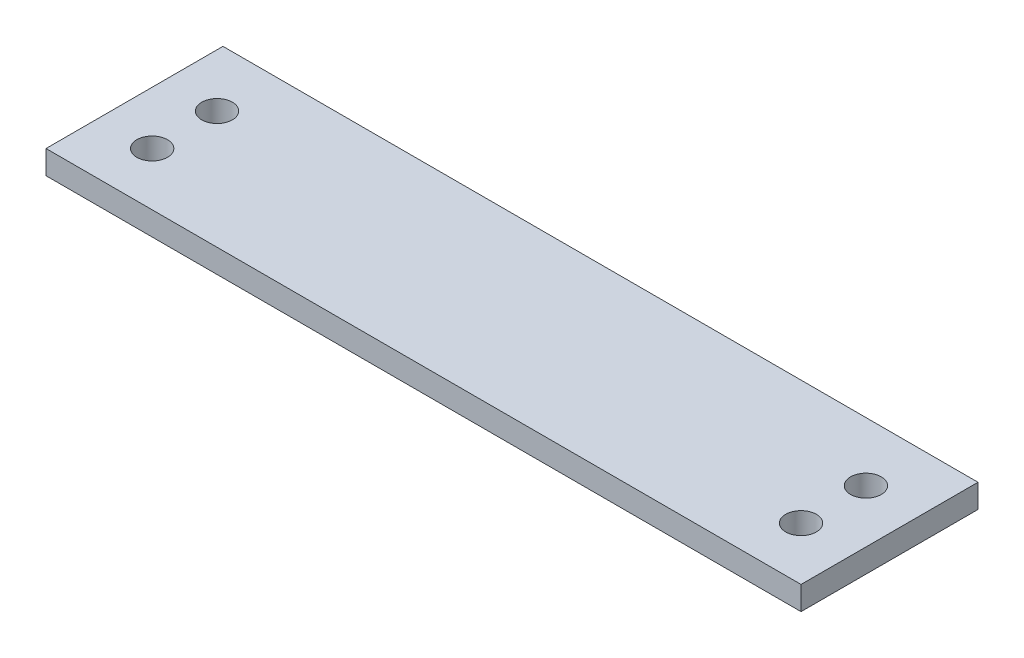
ISO-10303-21;
HEADER;
FILE_DESCRIPTION(('STEP AP214'),'2;1');
FILE_NAME('part.step','',(''),(''),'','','');
FILE_SCHEMA(('AUTOMOTIVE_DESIGN { 1 0 10303 214 1 1 1 1 }'));
ENDSEC;
DATA;
#1=APPLICATION_CONTEXT('core data for automotive mechanical design processes');
#2=APPLICATION_PROTOCOL_DEFINITION('international standard','automotive_design',2000,#1);
#3=PRODUCT_CONTEXT('',#1,'mechanical');
#4=PRODUCT('Part','Part','',(#3));
#5=PRODUCT_RELATED_PRODUCT_CATEGORY('part','',(#4));
#6=PRODUCT_DEFINITION_FORMATION('','',#4);
#7=PRODUCT_DEFINITION_CONTEXT('part definition',#1,'design');
#8=PRODUCT_DEFINITION('design','',#6,#7);
#9=PRODUCT_DEFINITION_SHAPE('','',#8);
#10=(LENGTH_UNIT() NAMED_UNIT(*) SI_UNIT(.MILLI.,.METRE.));
#11=(NAMED_UNIT(*) PLANE_ANGLE_UNIT() SI_UNIT($,.RADIAN.));
#12=(NAMED_UNIT(*) SI_UNIT($,.STERADIAN.) SOLID_ANGLE_UNIT());
#13=UNCERTAINTY_MEASURE_WITH_UNIT(LENGTH_MEASURE(1.E-05),#10,'distance_accuracy_value','');
#14=(GEOMETRIC_REPRESENTATION_CONTEXT(3) GLOBAL_UNCERTAINTY_ASSIGNED_CONTEXT((#13)) GLOBAL_UNIT_ASSIGNED_CONTEXT((#10,
#11,#12)) REPRESENTATION_CONTEXT('',''));
#15=CARTESIAN_POINT('',(0.,0.,0.));
#16=DIRECTION('',(0.,0.,1.));
#17=DIRECTION('',(1.,0.,0.));
#18=AXIS2_PLACEMENT_3D('',#15,#16,#17);
#19=CARTESIAN_POINT('',(0.,0.,70.));
#20=DIRECTION('',(0.,0.,1.));
#21=DIRECTION('',(1.,0.,0.));
#22=AXIS2_PLACEMENT_3D('',#19,#20,#21);
#23=PLANE('',#22);
#24=DIRECTION('',(-1.,0.,0.));
#25=VECTOR('',#24,1.);
#26=CARTESIAN_POINT('',(0.,-2.,70.));
#27=LINE('',#26,#25);
#28=CARTESIAN_POINT('',(64.,-2.,70.));
#29=VERTEX_POINT('',#28);
#30=CARTESIAN_POINT('',(-64.,-2.,70.));
#31=VERTEX_POINT('',#30);
#32=EDGE_CURVE('E10',#29,#31,#27,.T.);
#33=ORIENTED_EDGE('',*,*,#32,.F.);
#34=DIRECTION('',(0.,-1.,0.));
#35=VECTOR('',#34,1.);
#36=CARTESIAN_POINT('',(64.,0.,70.));
#37=LINE('',#36,#35);
#38=CARTESIAN_POINT('',(64.,2.,70.));
#39=VERTEX_POINT('',#38);
#40=EDGE_CURVE('E62',#39,#29,#37,.T.);
#41=ORIENTED_EDGE('',*,*,#40,.F.);
#42=DIRECTION('',(1.,0.,0.));
#43=VECTOR('',#42,1.);
#44=CARTESIAN_POINT('',(0.,2.,70.));
#45=LINE('',#44,#43);
#46=CARTESIAN_POINT('',(-64.,2.,70.));
#47=VERTEX_POINT('',#46);
#48=EDGE_CURVE('E90',#47,#39,#45,.T.);
#49=ORIENTED_EDGE('',*,*,#48,.F.);
#50=DIRECTION('',(0.,1.,0.));
#51=VECTOR('',#50,1.);
#52=CARTESIAN_POINT('',(-64.,0.,70.));
#53=LINE('',#52,#51);
#54=EDGE_CURVE('E24',#31,#47,#53,.T.);
#55=ORIENTED_EDGE('',*,*,#54,.F.);
#56=EDGE_LOOP('',(#33,#41,#49,#55));
#57=FACE_BOUND('',#56,.T.);
#58=ADVANCED_FACE('F16',(#57),#23,.T.);
#59=CARTESIAN_POINT('',(0.,-2.,40.));
#60=DIRECTION('',(0.,-1.,0.));
#61=DIRECTION('',(0.,0.,-1.));
#62=AXIS2_PLACEMENT_3D('',#59,#60,#61);
#63=PLANE('',#62);
#64=CARTESIAN_POINT('',(55.,-2.,61.));
#65=DIRECTION('',(0.,-1.,0.));
#66=DIRECTION('',(0.,0.,-1.));
#67=AXIS2_PLACEMENT_3D('',#64,#65,#66);
#68=CIRCLE('',#67,2.6);
#69=CARTESIAN_POINT('',(55.,-2.,58.4));
#70=VERTEX_POINT('',#69);
#71=EDGE_CURVE('E102',#70,#70,#68,.T.);
#72=ORIENTED_EDGE('',*,*,#71,.F.);
#73=EDGE_LOOP('',(#72));
#74=FACE_BOUND('',#73,.T.);
#75=CARTESIAN_POINT('',(55.,-2.,50.));
#76=DIRECTION('',(0.,-1.,0.));
#77=DIRECTION('',(0.,0.,-1.));
#78=AXIS2_PLACEMENT_3D('',#75,#76,#77);
#79=CIRCLE('',#78,2.6);
#80=CARTESIAN_POINT('',(55.,-2.,47.4));
#81=VERTEX_POINT('',#80);
#82=EDGE_CURVE('E99',#81,#81,#79,.T.);
#83=ORIENTED_EDGE('',*,*,#82,.F.);
#84=EDGE_LOOP('',(#83));
#85=FACE_BOUND('',#84,.T.);
#86=CARTESIAN_POINT('',(-55.,-2.,61.));
#87=DIRECTION('',(0.,-1.,0.));
#88=DIRECTION('',(0.,0.,-1.));
#89=AXIS2_PLACEMENT_3D('',#86,#87,#88);
#90=CIRCLE('',#89,2.6);
#91=CARTESIAN_POINT('',(-55.,-2.,58.4));
#92=VERTEX_POINT('',#91);
#93=EDGE_CURVE('E96',#92,#92,#90,.T.);
#94=ORIENTED_EDGE('',*,*,#93,.F.);
#95=EDGE_LOOP('',(#94));
#96=FACE_BOUND('',#95,.T.);
#97=CARTESIAN_POINT('',(-55.,-2.,50.));
#98=DIRECTION('',(0.,-1.,0.));
#99=DIRECTION('',(0.,0.,-1.));
#100=AXIS2_PLACEMENT_3D('',#97,#98,#99);
#101=CIRCLE('',#100,2.6);
#102=CARTESIAN_POINT('',(-55.,-2.,47.4));
#103=VERTEX_POINT('',#102);
#104=EDGE_CURVE('E73',#103,#103,#101,.T.);
#105=ORIENTED_EDGE('',*,*,#104,.F.);
#106=EDGE_LOOP('',(#105));
#107=FACE_BOUND('',#106,.T.);
#108=DIRECTION('',(0.,0.,1.));
#109=VECTOR('',#108,1.);
#110=CARTESIAN_POINT('',(64.,-2.,40.));
#111=LINE('',#110,#109);
#112=CARTESIAN_POINT('',(64.,-2.,40.));
#113=VERTEX_POINT('',#112);
#114=EDGE_CURVE('E55',#113,#29,#111,.T.);
#115=ORIENTED_EDGE('',*,*,#114,.T.);
#116=ORIENTED_EDGE('',*,*,#32,.T.);
#117=DIRECTION('',(0.,0.,1.));
#118=VECTOR('',#117,1.);
#119=CARTESIAN_POINT('',(-64.,-2.,40.));
#120=LINE('',#119,#118);
#121=CARTESIAN_POINT('',(-64.,-2.,40.));
#122=VERTEX_POINT('',#121);
#123=EDGE_CURVE('E68',#122,#31,#120,.T.);
#124=ORIENTED_EDGE('',*,*,#123,.F.);
#125=DIRECTION('',(1.,0.,0.));
#126=VECTOR('',#125,1.);
#127=CARTESIAN_POINT('',(0.,-2.,40.));
#128=LINE('',#127,#126);
#129=EDGE_CURVE('E66',#122,#113,#128,.T.);
#130=ORIENTED_EDGE('',*,*,#129,.T.);
#131=EDGE_LOOP('',(#115,#116,#124,#130));
#132=FACE_BOUND('',#131,.T.);
#133=ADVANCED_FACE('F67',(#74,#85,#96,#107,#132),#63,.T.);
#134=CARTESIAN_POINT('',(-64.,0.,40.));
#135=DIRECTION('',(-1.,0.,0.));
#136=DIRECTION('',(0.,0.,1.));
#137=AXIS2_PLACEMENT_3D('',#134,#135,#136);
#138=PLANE('',#137);
#139=ORIENTED_EDGE('',*,*,#123,.T.);
#140=ORIENTED_EDGE('',*,*,#54,.T.);
#141=DIRECTION('',(0.,0.,1.));
#142=VECTOR('',#141,1.);
#143=CARTESIAN_POINT('',(-64.,2.,40.));
#144=LINE('',#143,#142);
#145=CARTESIAN_POINT('',(-64.,2.,40.));
#146=VERTEX_POINT('',#145);
#147=EDGE_CURVE('E85',#146,#47,#144,.T.);
#148=ORIENTED_EDGE('',*,*,#147,.F.);
#149=DIRECTION('',(0.,-1.,0.));
#150=VECTOR('',#149,1.);
#151=CARTESIAN_POINT('',(-64.,0.,40.));
#152=LINE('',#151,#150);
#153=EDGE_CURVE('E72',#146,#122,#152,.T.);
#154=ORIENTED_EDGE('',*,*,#153,.T.);
#155=EDGE_LOOP('',(#139,#140,#148,#154));
#156=FACE_BOUND('',#155,.T.);
#157=ADVANCED_FACE('F121',(#156),#138,.T.);
#158=CARTESIAN_POINT('',(0.,2.,40.));
#159=DIRECTION('',(0.,1.,0.));
#160=DIRECTION('',(0.,0.,1.));
#161=AXIS2_PLACEMENT_3D('',#158,#159,#160);
#162=PLANE('',#161);
#163=CARTESIAN_POINT('',(55.,2.,61.));
#164=DIRECTION('',(0.,1.,0.));
#165=DIRECTION('',(0.,0.,1.));
#166=AXIS2_PLACEMENT_3D('',#163,#164,#165);
#167=CIRCLE('',#166,2.6);
#168=CARTESIAN_POINT('',(55.,2.,63.6));
#169=VERTEX_POINT('',#168);
#170=EDGE_CURVE('E19',#169,#169,#167,.T.);
#171=ORIENTED_EDGE('',*,*,#170,.F.);
#172=EDGE_LOOP('',(#171));
#173=FACE_BOUND('',#172,.T.);
#174=CARTESIAN_POINT('',(55.,2.,50.));
#175=DIRECTION('',(0.,1.,0.));
#176=DIRECTION('',(0.,0.,1.));
#177=AXIS2_PLACEMENT_3D('',#174,#175,#176);
#178=CIRCLE('',#177,2.6);
#179=CARTESIAN_POINT('',(55.,2.,52.6));
#180=VERTEX_POINT('',#179);
#181=EDGE_CURVE('E100',#180,#180,#178,.T.);
#182=ORIENTED_EDGE('',*,*,#181,.F.);
#183=EDGE_LOOP('',(#182));
#184=FACE_BOUND('',#183,.T.);
#185=CARTESIAN_POINT('',(-55.,2.,61.));
#186=DIRECTION('',(0.,1.,0.));
#187=DIRECTION('',(0.,0.,1.));
#188=AXIS2_PLACEMENT_3D('',#185,#186,#187);
#189=CIRCLE('',#188,2.6);
#190=CARTESIAN_POINT('',(-55.,2.,63.6));
#191=VERTEX_POINT('',#190);
#192=EDGE_CURVE('E97',#191,#191,#189,.T.);
#193=ORIENTED_EDGE('',*,*,#192,.F.);
#194=EDGE_LOOP('',(#193));
#195=FACE_BOUND('',#194,.T.);
#196=CARTESIAN_POINT('',(-55.,2.,50.));
#197=DIRECTION('',(0.,1.,0.));
#198=DIRECTION('',(0.,0.,1.));
#199=AXIS2_PLACEMENT_3D('',#196,#197,#198);
#200=CIRCLE('',#199,2.6);
#201=CARTESIAN_POINT('',(-55.,2.,52.6));
#202=VERTEX_POINT('',#201);
#203=EDGE_CURVE('E93',#202,#202,#200,.T.);
#204=ORIENTED_EDGE('',*,*,#203,.F.);
#205=EDGE_LOOP('',(#204));
#206=FACE_BOUND('',#205,.T.);
#207=ORIENTED_EDGE('',*,*,#147,.T.);
#208=ORIENTED_EDGE('',*,*,#48,.T.);
#209=DIRECTION('',(0.,0.,1.));
#210=VECTOR('',#209,1.);
#211=CARTESIAN_POINT('',(64.,2.,40.));
#212=LINE('',#211,#210);
#213=CARTESIAN_POINT('',(64.,2.,40.));
#214=VERTEX_POINT('',#213);
#215=EDGE_CURVE('E63',#214,#39,#212,.T.);
#216=ORIENTED_EDGE('',*,*,#215,.F.);
#217=DIRECTION('',(-1.,0.,0.));
#218=VECTOR('',#217,1.);
#219=CARTESIAN_POINT('',(0.,2.,40.));
#220=LINE('',#219,#218);
#221=EDGE_CURVE('E78',#214,#146,#220,.T.);
#222=ORIENTED_EDGE('',*,*,#221,.T.);
#223=EDGE_LOOP('',(#207,#208,#216,#222));
#224=FACE_BOUND('',#223,.T.);
#225=ADVANCED_FACE('F128',(#173,#184,#195,#206,#224),#162,.T.);
#226=CARTESIAN_POINT('',(0.,0.,40.));
#227=DIRECTION('',(0.,0.,-1.));
#228=DIRECTION('',(-1.,0.,0.));
#229=AXIS2_PLACEMENT_3D('',#226,#227,#228);
#230=PLANE('',#229);
#231=DIRECTION('',(0.,1.,0.));
#232=VECTOR('',#231,1.);
#233=CARTESIAN_POINT('',(64.,0.,40.));
#234=LINE('',#233,#232);
#235=EDGE_CURVE('E60',#113,#214,#234,.T.);
#236=ORIENTED_EDGE('',*,*,#235,.F.);
#237=ORIENTED_EDGE('',*,*,#129,.F.);
#238=ORIENTED_EDGE('',*,*,#153,.F.);
#239=ORIENTED_EDGE('',*,*,#221,.F.);
#240=EDGE_LOOP('',(#236,#237,#238,#239));
#241=FACE_BOUND('',#240,.T.);
#242=ADVANCED_FACE('F76',(#241),#230,.T.);
#243=CARTESIAN_POINT('',(64.,0.,40.));
#244=DIRECTION('',(1.,0.,0.));
#245=DIRECTION('',(0.,0.,-1.));
#246=AXIS2_PLACEMENT_3D('',#243,#244,#245);
#247=PLANE('',#246);
#248=ORIENTED_EDGE('',*,*,#235,.T.);
#249=ORIENTED_EDGE('',*,*,#215,.T.);
#250=ORIENTED_EDGE('',*,*,#40,.T.);
#251=ORIENTED_EDGE('',*,*,#114,.F.);
#252=EDGE_LOOP('',(#248,#249,#250,#251));
#253=FACE_BOUND('',#252,.T.);
#254=ADVANCED_FACE('F57',(#253),#247,.T.);
#255=CARTESIAN_POINT('',(-55.,-2.3,50.));
#256=DIRECTION('',(0.,1.,0.));
#257=DIRECTION('',(0.,0.,1.));
#258=AXIS2_PLACEMENT_3D('',#255,#256,#257);
#259=CYLINDRICAL_SURFACE('',#258,2.6);
#260=ORIENTED_EDGE('',*,*,#104,.T.);
#261=EDGE_LOOP('',(#260));
#262=FACE_BOUND('',#261,.T.);
#263=ORIENTED_EDGE('',*,*,#203,.T.);
#264=EDGE_LOOP('',(#263));
#265=FACE_BOUND('',#264,.T.);
#266=ADVANCED_FACE('F117',(#262,#265),#259,.F.);
#267=CARTESIAN_POINT('',(-55.,-2.3,61.));
#268=DIRECTION('',(0.,1.,0.));
#269=DIRECTION('',(0.,0.,1.));
#270=AXIS2_PLACEMENT_3D('',#267,#268,#269);
#271=CYLINDRICAL_SURFACE('',#270,2.6);
#272=ORIENTED_EDGE('',*,*,#93,.T.);
#273=EDGE_LOOP('',(#272));
#274=FACE_BOUND('',#273,.T.);
#275=ORIENTED_EDGE('',*,*,#192,.T.);
#276=EDGE_LOOP('',(#275));
#277=FACE_BOUND('',#276,.T.);
#278=ADVANCED_FACE('F142',(#274,#277),#271,.F.);
#279=CARTESIAN_POINT('',(55.,-2.3,50.));
#280=DIRECTION('',(0.,1.,0.));
#281=DIRECTION('',(0.,0.,1.));
#282=AXIS2_PLACEMENT_3D('',#279,#280,#281);
#283=CYLINDRICAL_SURFACE('',#282,2.6);
#284=ORIENTED_EDGE('',*,*,#82,.T.);
#285=EDGE_LOOP('',(#284));
#286=FACE_BOUND('',#285,.T.);
#287=ORIENTED_EDGE('',*,*,#181,.T.);
#288=EDGE_LOOP('',(#287));
#289=FACE_BOUND('',#288,.T.);
#290=ADVANCED_FACE('F145',(#286,#289),#283,.F.);
#291=CARTESIAN_POINT('',(55.,-2.3,61.));
#292=DIRECTION('',(0.,1.,0.));
#293=DIRECTION('',(0.,0.,1.));
#294=AXIS2_PLACEMENT_3D('',#291,#292,#293);
#295=CYLINDRICAL_SURFACE('',#294,2.6);
#296=ORIENTED_EDGE('',*,*,#71,.T.);
#297=EDGE_LOOP('',(#296));
#298=FACE_BOUND('',#297,.T.);
#299=ORIENTED_EDGE('',*,*,#170,.T.);
#300=EDGE_LOOP('',(#299));
#301=FACE_BOUND('',#300,.T.);
#302=ADVANCED_FACE('F149',(#298,#301),#295,.F.);
#303=CLOSED_SHELL('',(#58,#133,#157,#225,#242,#254,#266,#278,#290,#302));
#304=MANIFOLD_SOLID_BREP('B1',#303);
#305=ADVANCED_BREP_SHAPE_REPRESENTATION('',(#18,#304),#14);
#306=SHAPE_DEFINITION_REPRESENTATION(#9,#305);
ENDSEC;
END-ISO-10303-21;
